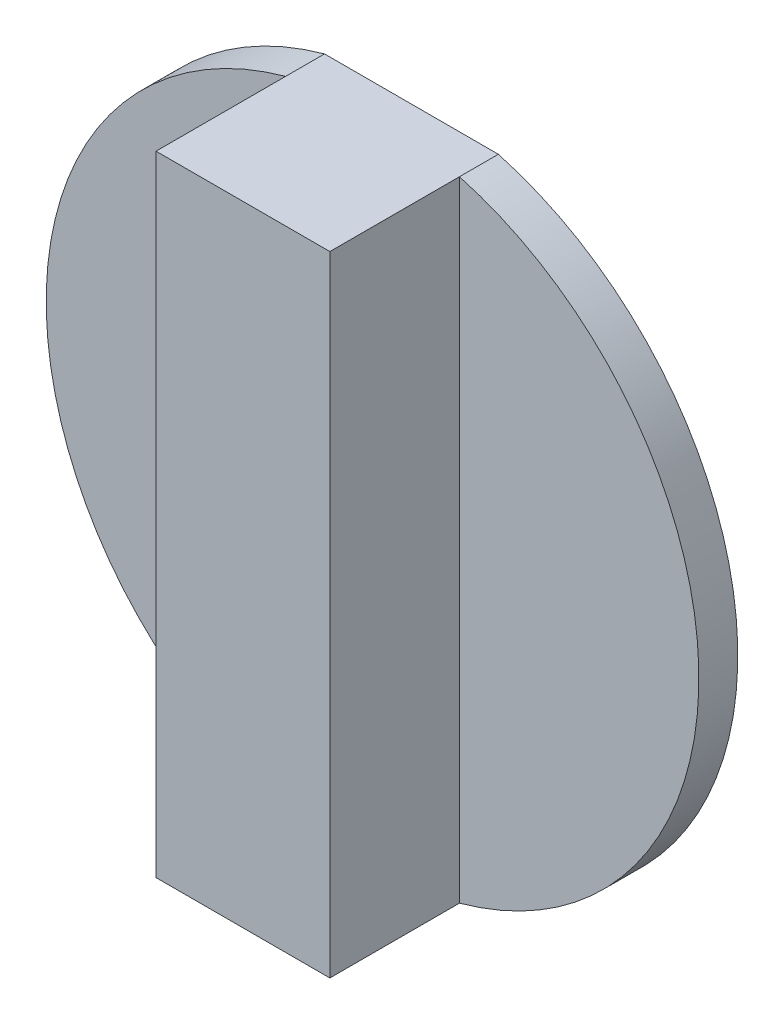
ISO-10303-21;
HEADER;
FILE_DESCRIPTION(('STEP AP214'),'2;1');
FILE_NAME('part.step','',(''),(''),'','','');
FILE_SCHEMA(('AUTOMOTIVE_DESIGN { 1 0 10303 214 1 1 1 1 }'));
ENDSEC;
DATA;
#1=APPLICATION_CONTEXT('core data for automotive mechanical design processes');
#2=APPLICATION_PROTOCOL_DEFINITION('international standard','automotive_design',2000,#1);
#3=PRODUCT_CONTEXT('',#1,'mechanical');
#4=PRODUCT('Part','Part','',(#3));
#5=PRODUCT_RELATED_PRODUCT_CATEGORY('part','',(#4));
#6=PRODUCT_DEFINITION_FORMATION('','',#4);
#7=PRODUCT_DEFINITION_CONTEXT('part definition',#1,'design');
#8=PRODUCT_DEFINITION('design','',#6,#7);
#9=PRODUCT_DEFINITION_SHAPE('','',#8);
#10=(LENGTH_UNIT() NAMED_UNIT(*) SI_UNIT(.MILLI.,.METRE.));
#11=(NAMED_UNIT(*) PLANE_ANGLE_UNIT() SI_UNIT($,.RADIAN.));
#12=(NAMED_UNIT(*) SI_UNIT($,.STERADIAN.) SOLID_ANGLE_UNIT());
#13=UNCERTAINTY_MEASURE_WITH_UNIT(LENGTH_MEASURE(1.E-05),#10,'distance_accuracy_value','');
#14=(GEOMETRIC_REPRESENTATION_CONTEXT(3) GLOBAL_UNCERTAINTY_ASSIGNED_CONTEXT((#13)) GLOBAL_UNIT_ASSIGNED_CONTEXT((#10,
#11,#12)) REPRESENTATION_CONTEXT('',''));
#15=CARTESIAN_POINT('',(0.,0.,0.));
#16=DIRECTION('',(0.,0.,1.));
#17=DIRECTION('',(1.,0.,0.));
#18=AXIS2_PLACEMENT_3D('',#15,#16,#17);
#19=CARTESIAN_POINT('',(0.,0.,3.));
#20=DIRECTION('',(0.,0.,1.));
#21=DIRECTION('',(1.,0.,0.));
#22=AXIS2_PLACEMENT_3D('',#19,#20,#21);
#23=PLANE('',#22);
#24=DIRECTION('',(0.,-1.,0.));
#25=VECTOR('',#24,1.);
#26=CARTESIAN_POINT('',(-3.22147185505468,90.9540927842072,3.));
#27=LINE('',#26,#25);
#28=CARTESIAN_POINT('',(-3.22147185505468,139.492737182254,3.));
#29=VERTEX_POINT('',#28);
#30=CARTESIAN_POINT('',(-3.22147185505468,90.9540927842072,3.));
#31=VERTEX_POINT('',#30);
#32=EDGE_CURVE('E60',#29,#31,#27,.T.);
#33=ORIENTED_EDGE('',*,*,#32,.F.);
#34=CARTESIAN_POINT('',(3.48436932166754,115.22341498323,3.));
#35=DIRECTION('',(0.,0.,1.));
#36=DIRECTION('',(1.,0.,0.));
#37=AXIS2_PLACEMENT_3D('',#34,#35,#36);
#38=CIRCLE('',#37,25.1787272491567);
#39=EDGE_CURVE('E87',#29,#31,#38,.T.);
#40=ORIENTED_EDGE('',*,*,#39,.T.);
#41=EDGE_LOOP('',(#33,#40));
#42=FACE_BOUND('',#41,.T.);
#43=ADVANCED_FACE('F43',(#42),#23,.T.);
#44=CARTESIAN_POINT('',(3.48436932166754,115.22341498323,3.));
#45=DIRECTION('',(0.,0.,-1.));
#46=DIRECTION('',(-1.,0.,0.));
#47=AXIS2_PLACEMENT_3D('',#44,#45,#46);
#48=CYLINDRICAL_SURFACE('',#47,25.1787272491567);
#49=CARTESIAN_POINT('',(3.48436932166754,115.22341498323,0.));
#50=DIRECTION('',(0.,0.,1.));
#51=DIRECTION('',(1.,0.,0.));
#52=AXIS2_PLACEMENT_3D('',#49,#50,#51);
#53=CIRCLE('',#52,25.1787272491567);
#54=CARTESIAN_POINT('',(-3.22147185505468,139.492737182254,0.));
#55=VERTEX_POINT('',#54);
#56=CARTESIAN_POINT('',(-3.22147185505468,90.9540927842072,0.));
#57=VERTEX_POINT('',#56);
#58=EDGE_CURVE('E131',#55,#57,#53,.T.);
#59=ORIENTED_EDGE('',*,*,#58,.T.);
#60=DIRECTION('',(0.,0.,-1.));
#61=VECTOR('',#60,1.);
#62=CARTESIAN_POINT('',(-3.22147185505468,90.9540927842072,3.));
#63=LINE('',#62,#61);
#64=EDGE_CURVE('E11',#31,#57,#63,.T.);
#65=ORIENTED_EDGE('',*,*,#64,.F.);
#66=ORIENTED_EDGE('',*,*,#39,.F.);
#67=DIRECTION('',(0.,0.,-1.));
#68=VECTOR('',#67,1.);
#69=CARTESIAN_POINT('',(-3.22147185505468,139.492737182254,3.));
#70=LINE('',#69,#68);
#71=EDGE_CURVE('E85',#29,#55,#70,.T.);
#72=ORIENTED_EDGE('',*,*,#71,.T.);
#73=EDGE_LOOP('',(#59,#65,#66,#72));
#74=FACE_BOUND('',#73,.T.);
#75=ADVANCED_FACE('F45',(#74),#48,.T.);
#76=CARTESIAN_POINT('',(0.,90.9540927842072,3.));
#77=DIRECTION('',(0.,1.,0.));
#78=DIRECTION('',(0.,0.,1.));
#79=AXIS2_PLACEMENT_3D('',#76,#77,#78);
#80=PLANE('',#79);
#81=DIRECTION('',(1.,0.,0.));
#82=VECTOR('',#81,1.);
#83=CARTESIAN_POINT('',(0.,90.9540927842072,0.));
#84=LINE('',#83,#82);
#85=CARTESIAN_POINT('',(10.1902104983897,90.9540927842072,0.));
#86=VERTEX_POINT('',#85);
#87=EDGE_CURVE('E136',#57,#86,#84,.T.);
#88=ORIENTED_EDGE('',*,*,#87,.T.);
#89=DIRECTION('',(0.,0.,-1.));
#90=VECTOR('',#89,1.);
#91=CARTESIAN_POINT('',(10.1902104983897,90.9540927842072,3.));
#92=LINE('',#91,#90);
#93=CARTESIAN_POINT('',(10.1902104983897,90.9540927842072,3.));
#94=VERTEX_POINT('',#93);
#95=EDGE_CURVE('E53',#94,#86,#92,.T.);
#96=ORIENTED_EDGE('',*,*,#95,.F.);
#97=DIRECTION('',(0.,0.,-1.));
#98=VECTOR('',#97,1.);
#99=CARTESIAN_POINT('',(10.1902104983897,90.9540927842072,13.));
#100=LINE('',#99,#98);
#101=CARTESIAN_POINT('',(10.1902104983897,90.9540927842072,13.));
#102=VERTEX_POINT('',#101);
#103=EDGE_CURVE('E112',#102,#94,#100,.T.);
#104=ORIENTED_EDGE('',*,*,#103,.F.);
#105=DIRECTION('',(1.,0.,0.));
#106=VECTOR('',#105,1.);
#107=CARTESIAN_POINT('',(10.1902104983897,90.9540927842072,13.));
#108=LINE('',#107,#106);
#109=CARTESIAN_POINT('',(-3.22147185505468,90.9540927842072,13.));
#110=VERTEX_POINT('',#109);
#111=EDGE_CURVE('E105',#110,#102,#108,.T.);
#112=ORIENTED_EDGE('',*,*,#111,.F.);
#113=DIRECTION('',(0.,0.,-1.));
#114=VECTOR('',#113,1.);
#115=CARTESIAN_POINT('',(-3.22147185505468,90.9540927842072,13.));
#116=LINE('',#115,#114);
#117=EDGE_CURVE('E109',#110,#31,#116,.T.);
#118=ORIENTED_EDGE('',*,*,#117,.T.);
#119=ORIENTED_EDGE('',*,*,#64,.T.);
#120=EDGE_LOOP('',(#88,#96,#104,#112,#118,#119));
#121=FACE_BOUND('',#120,.T.);
#122=ADVANCED_FACE('F107',(#121),#80,.F.);
#123=CARTESIAN_POINT('',(3.48436932166754,115.22341498323,3.));
#124=DIRECTION('',(0.,0.,-1.));
#125=DIRECTION('',(-1.,0.,0.));
#126=AXIS2_PLACEMENT_3D('',#123,#124,#125);
#127=CYLINDRICAL_SURFACE('',#126,25.1787272491567);
#128=CARTESIAN_POINT('',(3.48436932166754,115.22341498323,0.));
#129=DIRECTION('',(0.,0.,1.));
#130=DIRECTION('',(1.,0.,0.));
#131=AXIS2_PLACEMENT_3D('',#128,#129,#130);
#132=CIRCLE('',#131,25.1787272491567);
#133=CARTESIAN_POINT('',(10.1902104983897,139.492737182254,0.));
#134=VERTEX_POINT('',#133);
#135=EDGE_CURVE('E151',#86,#134,#132,.T.);
#136=ORIENTED_EDGE('',*,*,#135,.T.);
#137=DIRECTION('',(0.,0.,-1.));
#138=VECTOR('',#137,1.);
#139=CARTESIAN_POINT('',(10.1902104983897,139.492737182254,3.));
#140=LINE('',#139,#138);
#141=CARTESIAN_POINT('',(10.1902104983897,139.492737182254,3.));
#142=VERTEX_POINT('',#141);
#143=EDGE_CURVE('E79',#142,#134,#140,.T.);
#144=ORIENTED_EDGE('',*,*,#143,.F.);
#145=CARTESIAN_POINT('',(3.48436932166754,115.22341498323,3.));
#146=DIRECTION('',(0.,0.,1.));
#147=DIRECTION('',(1.,0.,0.));
#148=AXIS2_PLACEMENT_3D('',#145,#146,#147);
#149=CIRCLE('',#148,25.1787272491567);
#150=EDGE_CURVE('E145',#94,#142,#149,.T.);
#151=ORIENTED_EDGE('',*,*,#150,.F.);
#152=ORIENTED_EDGE('',*,*,#95,.T.);
#153=EDGE_LOOP('',(#136,#144,#151,#152));
#154=FACE_BOUND('',#153,.T.);
#155=ADVANCED_FACE('F164',(#154),#127,.T.);
#156=CARTESIAN_POINT('',(0.,139.492737182254,3.));
#157=DIRECTION('',(0.,1.,0.));
#158=DIRECTION('',(0.,0.,1.));
#159=AXIS2_PLACEMENT_3D('',#156,#157,#158);
#160=PLANE('',#159);
#161=DIRECTION('',(1.,0.,0.));
#162=VECTOR('',#161,1.);
#163=CARTESIAN_POINT('',(0.,139.492737182254,0.));
#164=LINE('',#163,#162);
#165=EDGE_CURVE('E146',#55,#134,#164,.T.);
#166=ORIENTED_EDGE('',*,*,#165,.F.);
#167=ORIENTED_EDGE('',*,*,#71,.F.);
#168=DIRECTION('',(0.,0.,-1.));
#169=VECTOR('',#168,1.);
#170=CARTESIAN_POINT('',(-3.22147185505468,139.492737182254,13.));
#171=LINE('',#170,#169);
#172=CARTESIAN_POINT('',(-3.22147185505468,139.492737182254,13.));
#173=VERTEX_POINT('',#172);
#174=EDGE_CURVE('E168',#173,#29,#171,.T.);
#175=ORIENTED_EDGE('',*,*,#174,.F.);
#176=DIRECTION('',(-1.,0.,0.));
#177=VECTOR('',#176,1.);
#178=CARTESIAN_POINT('',(-3.22147185505468,139.492737182254,13.));
#179=LINE('',#178,#177);
#180=CARTESIAN_POINT('',(10.1902104983897,139.492737182254,13.));
#181=VERTEX_POINT('',#180);
#182=EDGE_CURVE('E122',#181,#173,#179,.T.);
#183=ORIENTED_EDGE('',*,*,#182,.F.);
#184=DIRECTION('',(0.,0.,-1.));
#185=VECTOR('',#184,1.);
#186=CARTESIAN_POINT('',(10.1902104983897,139.492737182254,13.));
#187=LINE('',#186,#185);
#188=EDGE_CURVE('E139',#181,#142,#187,.T.);
#189=ORIENTED_EDGE('',*,*,#188,.T.);
#190=ORIENTED_EDGE('',*,*,#143,.T.);
#191=EDGE_LOOP('',(#166,#167,#175,#183,#189,#190));
#192=FACE_BOUND('',#191,.T.);
#193=ADVANCED_FACE('F167',(#192),#160,.T.);
#194=DIRECTION('',(0.,1.,0.));
#195=VECTOR('',#194,1.);
#196=CARTESIAN_POINT('',(10.1902104983897,139.492737182254,3.));
#197=LINE('',#196,#195);
#198=EDGE_CURVE('E127',#94,#142,#197,.T.);
#199=ORIENTED_EDGE('',*,*,#198,.F.);
#200=ORIENTED_EDGE('',*,*,#150,.T.);
#201=EDGE_LOOP('',(#199,#200));
#202=FACE_BOUND('',#201,.T.);
#203=ADVANCED_FACE('F185',(#202),#23,.T.);
#204=CARTESIAN_POINT('',(0.,0.,0.));
#205=DIRECTION('',(0.,0.,1.));
#206=DIRECTION('',(1.,0.,0.));
#207=AXIS2_PLACEMENT_3D('',#204,#205,#206);
#208=PLANE('',#207);
#209=ORIENTED_EDGE('',*,*,#58,.F.);
#210=ORIENTED_EDGE('',*,*,#165,.T.);
#211=ORIENTED_EDGE('',*,*,#135,.F.);
#212=ORIENTED_EDGE('',*,*,#87,.F.);
#213=EDGE_LOOP('',(#209,#210,#211,#212));
#214=FACE_BOUND('',#213,.T.);
#215=ADVANCED_FACE('F166',(#214),#208,.F.);
#216=CARTESIAN_POINT('',(-3.22147185505468,90.9540927842072,13.));
#217=DIRECTION('',(1.,0.,0.));
#218=DIRECTION('',(0.,0.,-1.));
#219=AXIS2_PLACEMENT_3D('',#216,#217,#218);
#220=PLANE('',#219);
#221=ORIENTED_EDGE('',*,*,#32,.T.);
#222=ORIENTED_EDGE('',*,*,#117,.F.);
#223=DIRECTION('',(0.,-1.,0.));
#224=VECTOR('',#223,1.);
#225=CARTESIAN_POINT('',(-3.22147185505468,90.9540927842072,13.));
#226=LINE('',#225,#224);
#227=EDGE_CURVE('E117',#173,#110,#226,.T.);
#228=ORIENTED_EDGE('',*,*,#227,.F.);
#229=ORIENTED_EDGE('',*,*,#174,.T.);
#230=EDGE_LOOP('',(#221,#222,#228,#229));
#231=FACE_BOUND('',#230,.T.);
#232=ADVANCED_FACE('F129',(#231),#220,.F.);
#233=CARTESIAN_POINT('',(10.1902104983897,139.492737182254,13.));
#234=DIRECTION('',(-1.,0.,0.));
#235=DIRECTION('',(0.,0.,1.));
#236=AXIS2_PLACEMENT_3D('',#233,#234,#235);
#237=PLANE('',#236);
#238=ORIENTED_EDGE('',*,*,#198,.T.);
#239=ORIENTED_EDGE('',*,*,#188,.F.);
#240=DIRECTION('',(0.,1.,0.));
#241=VECTOR('',#240,1.);
#242=CARTESIAN_POINT('',(10.1902104983897,139.492737182254,13.));
#243=LINE('',#242,#241);
#244=EDGE_CURVE('E116',#102,#181,#243,.T.);
#245=ORIENTED_EDGE('',*,*,#244,.F.);
#246=ORIENTED_EDGE('',*,*,#103,.T.);
#247=EDGE_LOOP('',(#238,#239,#245,#246));
#248=FACE_BOUND('',#247,.T.);
#249=ADVANCED_FACE('F183',(#248),#237,.F.);
#250=CARTESIAN_POINT('',(0.,0.,13.));
#251=DIRECTION('',(0.,0.,-1.));
#252=DIRECTION('',(-1.,0.,0.));
#253=AXIS2_PLACEMENT_3D('',#250,#251,#252);
#254=PLANE('',#253);
#255=ORIENTED_EDGE('',*,*,#227,.T.);
#256=ORIENTED_EDGE('',*,*,#111,.T.);
#257=ORIENTED_EDGE('',*,*,#244,.T.);
#258=ORIENTED_EDGE('',*,*,#182,.T.);
#259=EDGE_LOOP('',(#255,#256,#257,#258));
#260=FACE_BOUND('',#259,.T.);
#261=ADVANCED_FACE('F120',(#260),#254,.F.);
#262=CLOSED_SHELL('',(#43,#75,#122,#155,#193,#203,#215,#232,#249,#261));
#263=MANIFOLD_SOLID_BREP('B2',#262);
#264=ADVANCED_BREP_SHAPE_REPRESENTATION('',(#18,#263),#14);
#265=SHAPE_DEFINITION_REPRESENTATION(#9,#264);
ENDSEC;
END-ISO-10303-21;
